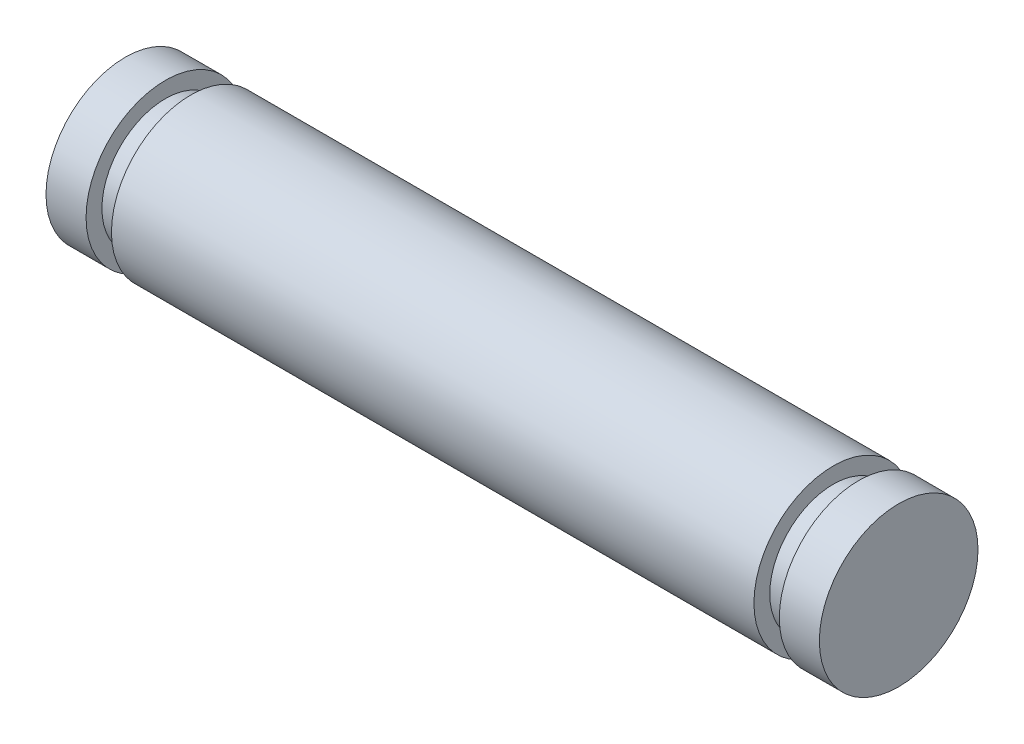
ISO-10303-21;
HEADER;
FILE_DESCRIPTION(('STEP AP214'),'2;1');
FILE_NAME('part.step','',(''),(''),'','','');
FILE_SCHEMA(('AUTOMOTIVE_DESIGN { 1 0 10303 214 1 1 1 1 }'));
ENDSEC;
DATA;
#1=APPLICATION_CONTEXT('core data for automotive mechanical design processes');
#2=APPLICATION_PROTOCOL_DEFINITION('international standard','automotive_design',2000,#1);
#3=PRODUCT_CONTEXT('',#1,'mechanical');
#4=PRODUCT('Part','Part','',(#3));
#5=PRODUCT_RELATED_PRODUCT_CATEGORY('part','',(#4));
#6=PRODUCT_DEFINITION_FORMATION('','',#4);
#7=PRODUCT_DEFINITION_CONTEXT('part definition',#1,'design');
#8=PRODUCT_DEFINITION('design','',#6,#7);
#9=PRODUCT_DEFINITION_SHAPE('','',#8);
#10=(LENGTH_UNIT() NAMED_UNIT(*) SI_UNIT(.MILLI.,.METRE.));
#11=(NAMED_UNIT(*) PLANE_ANGLE_UNIT() SI_UNIT($,.RADIAN.));
#12=(NAMED_UNIT(*) SI_UNIT($,.STERADIAN.) SOLID_ANGLE_UNIT());
#13=UNCERTAINTY_MEASURE_WITH_UNIT(LENGTH_MEASURE(1.E-05),#10,'distance_accuracy_value','');
#14=(GEOMETRIC_REPRESENTATION_CONTEXT(3) GLOBAL_UNCERTAINTY_ASSIGNED_CONTEXT((#13)) GLOBAL_UNIT_ASSIGNED_CONTEXT((#10,
#11,#12)) REPRESENTATION_CONTEXT('',''));
#15=CARTESIAN_POINT('',(0.,0.,0.));
#16=DIRECTION('',(0.,0.,1.));
#17=DIRECTION('',(1.,0.,0.));
#18=AXIS2_PLACEMENT_3D('',#15,#16,#17);
#19=CARTESIAN_POINT('',(9.75,0.,0.));
#20=DIRECTION('',(-1.,0.,0.));
#21=DIRECTION('',(0.,0.,1.));
#22=AXIS2_PLACEMENT_3D('',#19,#20,#21);
#23=CYLINDRICAL_SURFACE('',#22,2.);
#24=CARTESIAN_POINT('',(-8.1,0.,0.));
#25=DIRECTION('',(-1.,0.,0.));
#26=DIRECTION('',(0.,0.,1.));
#27=AXIS2_PLACEMENT_3D('',#24,#25,#26);
#28=CIRCLE('',#27,2.);
#29=CARTESIAN_POINT('',(-8.1,0.,2.));
#30=VERTEX_POINT('',#29);
#31=EDGE_CURVE('E48',#30,#30,#28,.T.);
#32=ORIENTED_EDGE('',*,*,#31,.F.);
#33=EDGE_LOOP('',(#32));
#34=FACE_BOUND('',#33,.T.);
#35=CARTESIAN_POINT('',(8.1,0.,0.));
#36=DIRECTION('',(-1.,0.,0.));
#37=DIRECTION('',(0.,0.,1.));
#38=AXIS2_PLACEMENT_3D('',#35,#36,#37);
#39=CIRCLE('',#38,2.);
#40=CARTESIAN_POINT('',(8.1,0.,2.));
#41=VERTEX_POINT('',#40);
#42=EDGE_CURVE('E60',#41,#41,#39,.T.);
#43=ORIENTED_EDGE('',*,*,#42,.T.);
#44=EDGE_LOOP('',(#43));
#45=FACE_BOUND('',#44,.T.);
#46=ADVANCED_FACE('F30',(#34,#45),#23,.T.);
#47=CARTESIAN_POINT('',(-9.75,0.,0.));
#48=DIRECTION('',(1.,0.,0.));
#49=DIRECTION('',(0.,0.,-1.));
#50=AXIS2_PLACEMENT_3D('',#47,#48,#49);
#51=CIRCLE('',#50,2.);
#52=CARTESIAN_POINT('',(-9.75,0.,-2.));
#53=VERTEX_POINT('',#52);
#54=EDGE_CURVE('E34',#53,#53,#51,.T.);
#55=ORIENTED_EDGE('',*,*,#54,.T.);
#56=EDGE_LOOP('',(#55));
#57=FACE_BOUND('',#56,.T.);
#58=CARTESIAN_POINT('',(-8.74,0.,0.));
#59=DIRECTION('',(-1.,0.,0.));
#60=DIRECTION('',(0.,0.,1.));
#61=AXIS2_PLACEMENT_3D('',#58,#59,#60);
#62=CIRCLE('',#61,2.);
#63=CARTESIAN_POINT('',(-8.74,0.,2.));
#64=VERTEX_POINT('',#63);
#65=EDGE_CURVE('E51',#64,#64,#62,.T.);
#66=ORIENTED_EDGE('',*,*,#65,.T.);
#67=EDGE_LOOP('',(#66));
#68=FACE_BOUND('',#67,.T.);
#69=ADVANCED_FACE('F32',(#57,#68),#23,.T.);
#70=CARTESIAN_POINT('',(-9.75,0.,0.));
#71=DIRECTION('',(1.,0.,0.));
#72=DIRECTION('',(0.,0.,-1.));
#73=AXIS2_PLACEMENT_3D('',#70,#71,#72);
#74=PLANE('',#73);
#75=ORIENTED_EDGE('',*,*,#54,.F.);
#76=EDGE_LOOP('',(#75));
#77=FACE_BOUND('',#76,.T.);
#78=ADVANCED_FACE('F81',(#77),#74,.F.);
#79=CARTESIAN_POINT('',(-8.74,0.,-2.));
#80=DIRECTION('',(1.,0.,0.));
#81=DIRECTION('',(0.,0.,-1.));
#82=AXIS2_PLACEMENT_3D('',#79,#80,#81);
#83=PLANE('',#82);
#84=CARTESIAN_POINT('',(-8.74,0.,0.));
#85=DIRECTION('',(-1.,0.,0.));
#86=DIRECTION('',(0.,0.,1.));
#87=AXIS2_PLACEMENT_3D('',#84,#85,#86);
#88=CIRCLE('',#87,1.6);
#89=CARTESIAN_POINT('',(-8.74,0.,1.6));
#90=VERTEX_POINT('',#89);
#91=EDGE_CURVE('E41',#90,#90,#88,.T.);
#92=ORIENTED_EDGE('',*,*,#91,.T.);
#93=EDGE_LOOP('',(#92));
#94=FACE_BOUND('',#93,.T.);
#95=ORIENTED_EDGE('',*,*,#65,.F.);
#96=EDGE_LOOP('',(#95));
#97=FACE_BOUND('',#96,.T.);
#98=ADVANCED_FACE('F86',(#94,#97),#83,.T.);
#99=CARTESIAN_POINT('',(-10.725,0.,0.));
#100=DIRECTION('',(-1.,0.,0.));
#101=DIRECTION('',(0.,0.,1.));
#102=AXIS2_PLACEMENT_3D('',#99,#100,#101);
#103=CYLINDRICAL_SURFACE('',#102,1.6);
#104=CARTESIAN_POINT('',(-8.1,0.,0.));
#105=DIRECTION('',(-1.,0.,0.));
#106=DIRECTION('',(0.,0.,1.));
#107=AXIS2_PLACEMENT_3D('',#104,#105,#106);
#108=CIRCLE('',#107,1.6);
#109=CARTESIAN_POINT('',(-8.1,0.,1.6));
#110=VERTEX_POINT('',#109);
#111=EDGE_CURVE('E45',#110,#110,#108,.T.);
#112=ORIENTED_EDGE('',*,*,#111,.T.);
#113=EDGE_LOOP('',(#112));
#114=FACE_BOUND('',#113,.T.);
#115=ORIENTED_EDGE('',*,*,#91,.F.);
#116=EDGE_LOOP('',(#115));
#117=FACE_BOUND('',#116,.T.);
#118=ADVANCED_FACE('F93',(#114,#117),#103,.T.);
#119=CARTESIAN_POINT('',(-8.1,0.,-2.));
#120=DIRECTION('',(-1.,0.,0.));
#121=DIRECTION('',(0.,0.,1.));
#122=AXIS2_PLACEMENT_3D('',#119,#120,#121);
#123=PLANE('',#122);
#124=ORIENTED_EDGE('',*,*,#31,.T.);
#125=EDGE_LOOP('',(#124));
#126=FACE_BOUND('',#125,.T.);
#127=ORIENTED_EDGE('',*,*,#111,.F.);
#128=EDGE_LOOP('',(#127));
#129=FACE_BOUND('',#128,.T.);
#130=ADVANCED_FACE('F99',(#126,#129),#123,.T.);
#131=CARTESIAN_POINT('',(8.74,0.,-2.));
#132=DIRECTION('',(-1.,0.,0.));
#133=DIRECTION('',(0.,0.,-1.));
#134=AXIS2_PLACEMENT_3D('',#131,#132,#133);
#135=PLANE('',#134);
#136=CARTESIAN_POINT('',(8.74,0.,0.));
#137=DIRECTION('',(-1.,0.,0.));
#138=DIRECTION('',(0.,0.,1.));
#139=AXIS2_PLACEMENT_3D('',#136,#137,#138);
#140=CIRCLE('',#139,1.6);
#141=CARTESIAN_POINT('',(8.74,0.,1.6));
#142=VERTEX_POINT('',#141);
#143=EDGE_CURVE('E54',#142,#142,#140,.T.);
#144=ORIENTED_EDGE('',*,*,#143,.F.);
#145=EDGE_LOOP('',(#144));
#146=FACE_BOUND('',#145,.T.);
#147=CARTESIAN_POINT('',(8.74,0.,0.));
#148=DIRECTION('',(-1.,0.,0.));
#149=DIRECTION('',(0.,0.,1.));
#150=AXIS2_PLACEMENT_3D('',#147,#148,#149);
#151=CIRCLE('',#150,2.);
#152=CARTESIAN_POINT('',(8.74,0.,2.));
#153=VERTEX_POINT('',#152);
#154=EDGE_CURVE('E63',#153,#153,#151,.T.);
#155=ORIENTED_EDGE('',*,*,#154,.T.);
#156=EDGE_LOOP('',(#155));
#157=FACE_BOUND('',#156,.T.);
#158=ADVANCED_FACE('F67',(#146,#157),#135,.T.);
#159=CARTESIAN_POINT('',(10.725,0.,0.));
#160=DIRECTION('',(1.,0.,0.));
#161=DIRECTION('',(0.,0.,1.));
#162=AXIS2_PLACEMENT_3D('',#159,#160,#161);
#163=CYLINDRICAL_SURFACE('',#162,1.6);
#164=CARTESIAN_POINT('',(8.1,0.,0.));
#165=DIRECTION('',(-1.,0.,0.));
#166=DIRECTION('',(0.,0.,1.));
#167=AXIS2_PLACEMENT_3D('',#164,#165,#166);
#168=CIRCLE('',#167,1.6);
#169=CARTESIAN_POINT('',(8.1,0.,1.6));
#170=VERTEX_POINT('',#169);
#171=EDGE_CURVE('E57',#170,#170,#168,.T.);
#172=ORIENTED_EDGE('',*,*,#171,.F.);
#173=EDGE_LOOP('',(#172));
#174=FACE_BOUND('',#173,.T.);
#175=ORIENTED_EDGE('',*,*,#143,.T.);
#176=EDGE_LOOP('',(#175));
#177=FACE_BOUND('',#176,.T.);
#178=ADVANCED_FACE('F108',(#174,#177),#163,.T.);
#179=CARTESIAN_POINT('',(8.1,0.,-2.));
#180=DIRECTION('',(1.,0.,0.));
#181=DIRECTION('',(0.,0.,1.));
#182=AXIS2_PLACEMENT_3D('',#179,#180,#181);
#183=PLANE('',#182);
#184=ORIENTED_EDGE('',*,*,#42,.F.);
#185=EDGE_LOOP('',(#184));
#186=FACE_BOUND('',#185,.T.);
#187=ORIENTED_EDGE('',*,*,#171,.T.);
#188=EDGE_LOOP('',(#187));
#189=FACE_BOUND('',#188,.T.);
#190=ADVANCED_FACE('F76',(#186,#189),#183,.T.);
#191=CARTESIAN_POINT('',(9.75,0.,0.));
#192=DIRECTION('',(1.,0.,0.));
#193=DIRECTION('',(0.,0.,-1.));
#194=AXIS2_PLACEMENT_3D('',#191,#192,#193);
#195=PLANE('',#194);
#196=CARTESIAN_POINT('',(9.75,0.,0.));
#197=DIRECTION('',(1.,0.,0.));
#198=DIRECTION('',(0.,0.,-1.));
#199=AXIS2_PLACEMENT_3D('',#196,#197,#198);
#200=CIRCLE('',#199,2.);
#201=CARTESIAN_POINT('',(9.75,0.,-2.));
#202=VERTEX_POINT('',#201);
#203=EDGE_CURVE('E10',#202,#202,#200,.T.);
#204=ORIENTED_EDGE('',*,*,#203,.T.);
#205=EDGE_LOOP('',(#204));
#206=FACE_BOUND('',#205,.T.);
#207=ADVANCED_FACE('F71',(#206),#195,.T.);
#208=ORIENTED_EDGE('',*,*,#203,.F.);
#209=EDGE_LOOP('',(#208));
#210=FACE_BOUND('',#209,.T.);
#211=ORIENTED_EDGE('',*,*,#154,.F.);
#212=EDGE_LOOP('',(#211));
#213=FACE_BOUND('',#212,.T.);
#214=ADVANCED_FACE('F69',(#210,#213),#23,.T.);
#215=CLOSED_SHELL('',(#46,#69,#78,#98,#118,#130,#158,#178,#190,#207,#214));
#216=MANIFOLD_SOLID_BREP('B2',#215);
#217=ADVANCED_BREP_SHAPE_REPRESENTATION('',(#18,#216),#14);
#218=SHAPE_DEFINITION_REPRESENTATION(#9,#217);
ENDSEC;
END-ISO-10303-21;
